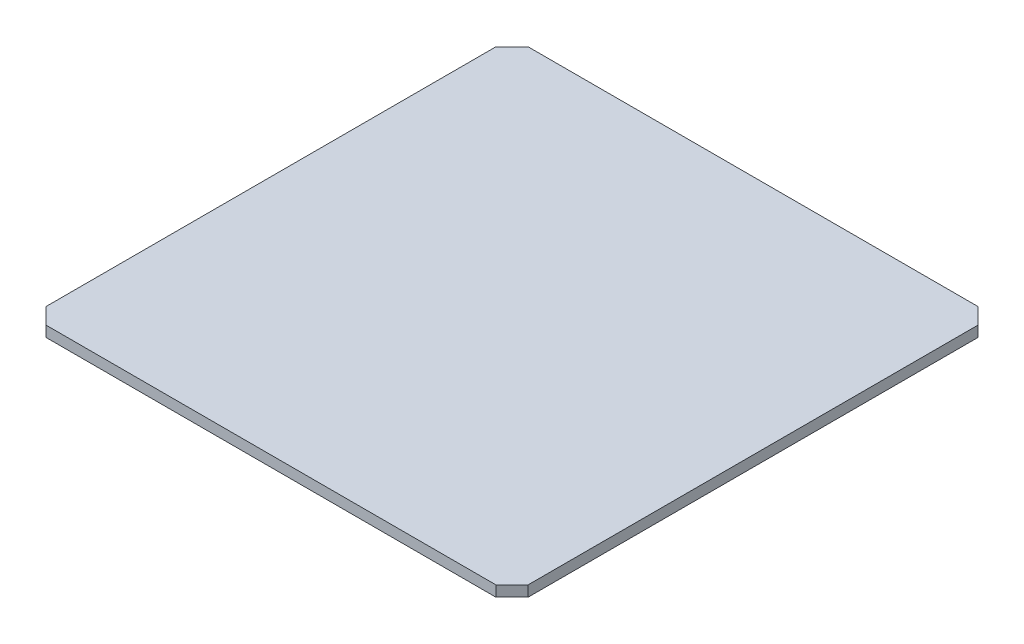
ISO-10303-21;
HEADER;
FILE_DESCRIPTION(('STEP AP214'),'2;1');
FILE_NAME('part.step','',(''),(''),'','','');
FILE_SCHEMA(('AUTOMOTIVE_DESIGN { 1 0 10303 214 1 1 1 1 }'));
ENDSEC;
DATA;
#1=APPLICATION_CONTEXT('core data for automotive mechanical design processes');
#2=APPLICATION_PROTOCOL_DEFINITION('international standard','automotive_design',2000,#1);
#3=PRODUCT_CONTEXT('',#1,'mechanical');
#4=PRODUCT('Part','Part','',(#3));
#5=PRODUCT_RELATED_PRODUCT_CATEGORY('part','',(#4));
#6=PRODUCT_DEFINITION_FORMATION('','',#4);
#7=PRODUCT_DEFINITION_CONTEXT('part definition',#1,'design');
#8=PRODUCT_DEFINITION('design','',#6,#7);
#9=PRODUCT_DEFINITION_SHAPE('','',#8);
#10=(LENGTH_UNIT() NAMED_UNIT(*) SI_UNIT(.MILLI.,.METRE.));
#11=(NAMED_UNIT(*) PLANE_ANGLE_UNIT() SI_UNIT($,.RADIAN.));
#12=(NAMED_UNIT(*) SI_UNIT($,.STERADIAN.) SOLID_ANGLE_UNIT());
#13=UNCERTAINTY_MEASURE_WITH_UNIT(LENGTH_MEASURE(1.E-05),#10,'distance_accuracy_value','');
#14=(GEOMETRIC_REPRESENTATION_CONTEXT(3) GLOBAL_UNCERTAINTY_ASSIGNED_CONTEXT((#13)) GLOBAL_UNIT_ASSIGNED_CONTEXT((#10,
#11,#12)) REPRESENTATION_CONTEXT('',''));
#15=CARTESIAN_POINT('',(0.,0.,0.));
#16=DIRECTION('',(0.,0.,1.));
#17=DIRECTION('',(1.,0.,0.));
#18=AXIS2_PLACEMENT_3D('',#15,#16,#17);
#19=CARTESIAN_POINT('',(0.,0.,0.));
#20=DIRECTION('',(0.,-1.,0.));
#21=DIRECTION('',(0.,0.,-1.));
#22=AXIS2_PLACEMENT_3D('',#19,#20,#21);
#23=PLANE('',#22);
#24=CARTESIAN_POINT('',(24.5,0.,-24.5));
#25=DIRECTION('',(0.,-1.,0.));
#26=DIRECTION('',(0.,0.,-1.));
#27=AXIS2_PLACEMENT_3D('',#24,#25,#26);
#28=CIRCLE('',#27,4.);
#29=CARTESIAN_POINT('',(24.5,0.,-28.5));
#30=VERTEX_POINT('',#29);
#31=EDGE_CURVE('E369',#30,#30,#28,.T.);
#32=ORIENTED_EDGE('',*,*,#31,.F.);
#33=EDGE_LOOP('',(#32));
#34=FACE_BOUND('',#33,.T.);
#35=CARTESIAN_POINT('',(-24.5,0.,-24.5));
#36=DIRECTION('',(0.,-1.,0.));
#37=DIRECTION('',(0.,0.,-1.));
#38=AXIS2_PLACEMENT_3D('',#35,#36,#37);
#39=CIRCLE('',#38,4.);
#40=CARTESIAN_POINT('',(-24.5,0.,-28.5));
#41=VERTEX_POINT('',#40);
#42=EDGE_CURVE('E357',#41,#41,#39,.T.);
#43=ORIENTED_EDGE('',*,*,#42,.F.);
#44=EDGE_LOOP('',(#43));
#45=FACE_BOUND('',#44,.T.);
#46=CARTESIAN_POINT('',(24.5,0.,24.5));
#47=DIRECTION('',(0.,-1.,0.));
#48=DIRECTION('',(0.,0.,-1.));
#49=AXIS2_PLACEMENT_3D('',#46,#47,#48);
#50=CIRCLE('',#49,4.);
#51=CARTESIAN_POINT('',(24.5,0.,20.5));
#52=VERTEX_POINT('',#51);
#53=EDGE_CURVE('E345',#52,#52,#50,.T.);
#54=ORIENTED_EDGE('',*,*,#53,.F.);
#55=EDGE_LOOP('',(#54));
#56=FACE_BOUND('',#55,.T.);
#57=CARTESIAN_POINT('',(-24.5,0.,24.5));
#58=DIRECTION('',(0.,-1.,0.));
#59=DIRECTION('',(0.,0.,-1.));
#60=AXIS2_PLACEMENT_3D('',#57,#58,#59);
#61=CIRCLE('',#60,4.);
#62=CARTESIAN_POINT('',(-24.5,0.,20.5));
#63=VERTEX_POINT('',#62);
#64=EDGE_CURVE('E331',#63,#63,#61,.T.);
#65=ORIENTED_EDGE('',*,*,#64,.F.);
#66=EDGE_LOOP('',(#65));
#67=FACE_BOUND('',#66,.T.);
#68=DIRECTION('',(-0.707106781186547,0.,0.707106781186547));
#69=VECTOR('',#68,1.);
#70=CARTESIAN_POINT('',(-45.,0.,-42.));
#71=LINE('',#70,#69);
#72=CARTESIAN_POINT('',(-42.,0.,-45.));
#73=VERTEX_POINT('',#72);
#74=CARTESIAN_POINT('',(-45.,0.,-42.));
#75=VERTEX_POINT('',#74);
#76=EDGE_CURVE('E160',#73,#75,#71,.T.);
#77=ORIENTED_EDGE('',*,*,#76,.F.);
#78=DIRECTION('',(-1.,0.,0.));
#79=VECTOR('',#78,1.);
#80=CARTESIAN_POINT('',(-42.,0.,-45.));
#81=LINE('',#80,#79);
#82=CARTESIAN_POINT('',(42.,0.,-45.));
#83=VERTEX_POINT('',#82);
#84=EDGE_CURVE('E103',#83,#73,#81,.T.);
#85=ORIENTED_EDGE('',*,*,#84,.F.);
#86=DIRECTION('',(-0.707106781186547,0.,-0.707106781186547));
#87=VECTOR('',#86,1.);
#88=CARTESIAN_POINT('',(42.,0.,-45.));
#89=LINE('',#88,#87);
#90=CARTESIAN_POINT('',(45.,0.,-42.));
#91=VERTEX_POINT('',#90);
#92=EDGE_CURVE('E179',#91,#83,#89,.T.);
#93=ORIENTED_EDGE('',*,*,#92,.F.);
#94=DIRECTION('',(0.,0.,-1.));
#95=VECTOR('',#94,1.);
#96=CARTESIAN_POINT('',(45.,0.,-42.));
#97=LINE('',#96,#95);
#98=CARTESIAN_POINT('',(45.,0.,42.));
#99=VERTEX_POINT('',#98);
#100=EDGE_CURVE('E145',#99,#91,#97,.T.);
#101=ORIENTED_EDGE('',*,*,#100,.F.);
#102=DIRECTION('',(0.707106781186548,0.,-0.707106781186547));
#103=VECTOR('',#102,1.);
#104=CARTESIAN_POINT('',(42.,0.,45.));
#105=LINE('',#104,#103);
#106=CARTESIAN_POINT('',(42.,0.,45.));
#107=VERTEX_POINT('',#106);
#108=EDGE_CURVE('E174',#107,#99,#105,.T.);
#109=ORIENTED_EDGE('',*,*,#108,.F.);
#110=DIRECTION('',(1.,0.,0.));
#111=VECTOR('',#110,1.);
#112=CARTESIAN_POINT('',(-42.,0.,45.));
#113=LINE('',#112,#111);
#114=CARTESIAN_POINT('',(-42.,0.,45.));
#115=VERTEX_POINT('',#114);
#116=EDGE_CURVE('E171',#115,#107,#113,.T.);
#117=ORIENTED_EDGE('',*,*,#116,.F.);
#118=DIRECTION('',(0.707106781186547,0.,0.707106781186548));
#119=VECTOR('',#118,1.);
#120=CARTESIAN_POINT('',(-45.,0.,42.));
#121=LINE('',#120,#119);
#122=CARTESIAN_POINT('',(-45.,0.,42.));
#123=VERTEX_POINT('',#122);
#124=EDGE_CURVE('E168',#123,#115,#121,.T.);
#125=ORIENTED_EDGE('',*,*,#124,.F.);
#126=DIRECTION('',(0.,0.,1.));
#127=VECTOR('',#126,1.);
#128=CARTESIAN_POINT('',(-45.,0.,-42.));
#129=LINE('',#128,#127);
#130=EDGE_CURVE('E164',#75,#123,#129,.T.);
#131=ORIENTED_EDGE('',*,*,#130,.F.);
#132=EDGE_LOOP('',(#77,#85,#93,#101,#109,#117,#125,#131));
#133=FACE_BOUND('',#132,.T.);
#134=DIRECTION('',(1.,0.,0.));
#135=VECTOR('',#134,1.);
#136=CARTESIAN_POINT('',(-7.5,0.,-3.75));
#137=LINE('',#136,#135);
#138=CARTESIAN_POINT('',(-7.5,0.,-3.75));
#139=VERTEX_POINT('',#138);
#140=CARTESIAN_POINT('',(7.5,0.,-3.75));
#141=VERTEX_POINT('',#140);
#142=EDGE_CURVE('E399',#139,#141,#137,.T.);
#143=ORIENTED_EDGE('',*,*,#142,.F.);
#144=DIRECTION('',(0.,0.,-1.));
#145=VECTOR('',#144,1.);
#146=CARTESIAN_POINT('',(-7.5,0.,3.75));
#147=LINE('',#146,#145);
#148=CARTESIAN_POINT('',(-7.5,0.,3.75));
#149=VERTEX_POINT('',#148);
#150=EDGE_CURVE('E403',#149,#139,#147,.T.);
#151=ORIENTED_EDGE('',*,*,#150,.F.);
#152=DIRECTION('',(-1.,0.,0.));
#153=VECTOR('',#152,1.);
#154=CARTESIAN_POINT('',(-7.5,0.,3.75));
#155=LINE('',#154,#153);
#156=CARTESIAN_POINT('',(7.5,0.,3.75));
#157=VERTEX_POINT('',#156);
#158=EDGE_CURVE('E392',#157,#149,#155,.T.);
#159=ORIENTED_EDGE('',*,*,#158,.F.);
#160=DIRECTION('',(0.,0.,1.));
#161=VECTOR('',#160,1.);
#162=CARTESIAN_POINT('',(7.5,0.,3.75));
#163=LINE('',#162,#161);
#164=EDGE_CURVE('E396',#141,#157,#163,.T.);
#165=ORIENTED_EDGE('',*,*,#164,.F.);
#166=EDGE_LOOP('',(#143,#151,#159,#165));
#167=FACE_BOUND('',#166,.T.);
#168=ADVANCED_FACE('F45',(#34,#45,#56,#67,#133,#167),#23,.T.);
#169=CARTESIAN_POINT('',(-45.,2.,-42.));
#170=DIRECTION('',(0.707106781186547,0.,0.707106781186547));
#171=DIRECTION('',(0.707106781186548,0.,-0.707106781186548));
#172=AXIS2_PLACEMENT_3D('',#169,#170,#171);
#173=PLANE('',#172);
#174=ORIENTED_EDGE('',*,*,#76,.T.);
#175=DIRECTION('',(0.,-1.,0.));
#176=VECTOR('',#175,1.);
#177=CARTESIAN_POINT('',(-45.,2.,-42.));
#178=LINE('',#177,#176);
#179=CARTESIAN_POINT('',(-45.,2.,-42.));
#180=VERTEX_POINT('',#179);
#181=EDGE_CURVE('E203',#180,#75,#178,.T.);
#182=ORIENTED_EDGE('',*,*,#181,.F.);
#183=DIRECTION('',(-0.707106781186547,0.,0.707106781186547));
#184=VECTOR('',#183,1.);
#185=CARTESIAN_POINT('',(-45.,2.,-42.));
#186=LINE('',#185,#184);
#187=CARTESIAN_POINT('',(-42.,2.,-45.));
#188=VERTEX_POINT('',#187);
#189=EDGE_CURVE('E184',#188,#180,#186,.T.);
#190=ORIENTED_EDGE('',*,*,#189,.F.);
#191=DIRECTION('',(0.,-1.,0.));
#192=VECTOR('',#191,1.);
#193=CARTESIAN_POINT('',(-42.,2.,-45.));
#194=LINE('',#193,#192);
#195=EDGE_CURVE('E156',#188,#73,#194,.T.);
#196=ORIENTED_EDGE('',*,*,#195,.T.);
#197=EDGE_LOOP('',(#174,#182,#190,#196));
#198=FACE_BOUND('',#197,.T.);
#199=ADVANCED_FACE('F47',(#198),#173,.F.);
#200=CARTESIAN_POINT('',(-45.,2.,-42.));
#201=DIRECTION('',(1.,0.,0.));
#202=DIRECTION('',(0.,0.,-1.));
#203=AXIS2_PLACEMENT_3D('',#200,#201,#202);
#204=PLANE('',#203);
#205=ORIENTED_EDGE('',*,*,#130,.T.);
#206=DIRECTION('',(0.,-1.,0.));
#207=VECTOR('',#206,1.);
#208=CARTESIAN_POINT('',(-45.,2.,42.));
#209=LINE('',#208,#207);
#210=CARTESIAN_POINT('',(-45.,2.,42.));
#211=VERTEX_POINT('',#210);
#212=EDGE_CURVE('E199',#211,#123,#209,.T.);
#213=ORIENTED_EDGE('',*,*,#212,.F.);
#214=DIRECTION('',(0.,0.,1.));
#215=VECTOR('',#214,1.);
#216=CARTESIAN_POINT('',(-45.,2.,-42.));
#217=LINE('',#216,#215);
#218=EDGE_CURVE('E112',#180,#211,#217,.T.);
#219=ORIENTED_EDGE('',*,*,#218,.F.);
#220=ORIENTED_EDGE('',*,*,#181,.T.);
#221=EDGE_LOOP('',(#205,#213,#219,#220));
#222=FACE_BOUND('',#221,.T.);
#223=ADVANCED_FACE('F251',(#222),#204,.F.);
#224=CARTESIAN_POINT('',(-45.,2.,42.));
#225=DIRECTION('',(0.707106781186548,0.,-0.707106781186547));
#226=DIRECTION('',(-0.707106781186547,0.,-0.707106781186548));
#227=AXIS2_PLACEMENT_3D('',#224,#225,#226);
#228=PLANE('',#227);
#229=ORIENTED_EDGE('',*,*,#124,.T.);
#230=DIRECTION('',(0.,-1.,0.));
#231=VECTOR('',#230,1.);
#232=CARTESIAN_POINT('',(-42.,2.,45.));
#233=LINE('',#232,#231);
#234=CARTESIAN_POINT('',(-42.,2.,45.));
#235=VERTEX_POINT('',#234);
#236=EDGE_CURVE('E195',#235,#115,#233,.T.);
#237=ORIENTED_EDGE('',*,*,#236,.F.);
#238=DIRECTION('',(0.707106781186547,0.,0.707106781186548));
#239=VECTOR('',#238,1.);
#240=CARTESIAN_POINT('',(-45.,2.,42.));
#241=LINE('',#240,#239);
#242=EDGE_CURVE('E314',#211,#235,#241,.T.);
#243=ORIENTED_EDGE('',*,*,#242,.F.);
#244=ORIENTED_EDGE('',*,*,#212,.T.);
#245=EDGE_LOOP('',(#229,#237,#243,#244));
#246=FACE_BOUND('',#245,.T.);
#247=ADVANCED_FACE('F301',(#246),#228,.F.);
#248=CARTESIAN_POINT('',(-42.,2.,45.));
#249=DIRECTION('',(0.,0.,-1.));
#250=DIRECTION('',(-1.,0.,0.));
#251=AXIS2_PLACEMENT_3D('',#248,#249,#250);
#252=PLANE('',#251);
#253=ORIENTED_EDGE('',*,*,#116,.T.);
#254=DIRECTION('',(0.,-1.,0.));
#255=VECTOR('',#254,1.);
#256=CARTESIAN_POINT('',(42.,2.,45.));
#257=LINE('',#256,#255);
#258=CARTESIAN_POINT('',(42.,2.,45.));
#259=VERTEX_POINT('',#258);
#260=EDGE_CURVE('E191',#259,#107,#257,.T.);
#261=ORIENTED_EDGE('',*,*,#260,.F.);
#262=DIRECTION('',(1.,0.,0.));
#263=VECTOR('',#262,1.);
#264=CARTESIAN_POINT('',(-42.,2.,45.));
#265=LINE('',#264,#263);
#266=EDGE_CURVE('E321',#235,#259,#265,.T.);
#267=ORIENTED_EDGE('',*,*,#266,.F.);
#268=ORIENTED_EDGE('',*,*,#236,.T.);
#269=EDGE_LOOP('',(#253,#261,#267,#268));
#270=FACE_BOUND('',#269,.T.);
#271=ADVANCED_FACE('F297',(#270),#252,.F.);
#272=CARTESIAN_POINT('',(42.,2.,45.));
#273=DIRECTION('',(-0.707106781186547,0.,-0.707106781186548));
#274=DIRECTION('',(-0.707106781186548,0.,0.707106781186547));
#275=AXIS2_PLACEMENT_3D('',#272,#273,#274);
#276=PLANE('',#275);
#277=ORIENTED_EDGE('',*,*,#108,.T.);
#278=DIRECTION('',(0.,-1.,0.));
#279=VECTOR('',#278,1.);
#280=CARTESIAN_POINT('',(45.,2.,42.));
#281=LINE('',#280,#279);
#282=CARTESIAN_POINT('',(45.,2.,42.));
#283=VERTEX_POINT('',#282);
#284=EDGE_CURVE('E149',#283,#99,#281,.T.);
#285=ORIENTED_EDGE('',*,*,#284,.F.);
#286=DIRECTION('',(0.707106781186548,0.,-0.707106781186547));
#287=VECTOR('',#286,1.);
#288=CARTESIAN_POINT('',(42.,2.,45.));
#289=LINE('',#288,#287);
#290=EDGE_CURVE('E135',#259,#283,#289,.T.);
#291=ORIENTED_EDGE('',*,*,#290,.F.);
#292=ORIENTED_EDGE('',*,*,#260,.T.);
#293=EDGE_LOOP('',(#277,#285,#291,#292));
#294=FACE_BOUND('',#293,.T.);
#295=ADVANCED_FACE('F294',(#294),#276,.F.);
#296=CARTESIAN_POINT('',(45.,2.,-42.));
#297=DIRECTION('',(-1.,0.,0.));
#298=DIRECTION('',(0.,0.,1.));
#299=AXIS2_PLACEMENT_3D('',#296,#297,#298);
#300=PLANE('',#299);
#301=ORIENTED_EDGE('',*,*,#100,.T.);
#302=DIRECTION('',(0.,-1.,0.));
#303=VECTOR('',#302,1.);
#304=CARTESIAN_POINT('',(45.,2.,-42.));
#305=LINE('',#304,#303);
#306=CARTESIAN_POINT('',(45.,2.,-42.));
#307=VERTEX_POINT('',#306);
#308=EDGE_CURVE('E142',#307,#91,#305,.T.);
#309=ORIENTED_EDGE('',*,*,#308,.F.);
#310=DIRECTION('',(0.,0.,-1.));
#311=VECTOR('',#310,1.);
#312=CARTESIAN_POINT('',(45.,2.,-42.));
#313=LINE('',#312,#311);
#314=EDGE_CURVE('E128',#283,#307,#313,.T.);
#315=ORIENTED_EDGE('',*,*,#314,.F.);
#316=ORIENTED_EDGE('',*,*,#284,.T.);
#317=EDGE_LOOP('',(#301,#309,#315,#316));
#318=FACE_BOUND('',#317,.T.);
#319=ADVANCED_FACE('F143',(#318),#300,.F.);
#320=CARTESIAN_POINT('',(42.,2.,-45.));
#321=DIRECTION('',(-0.707106781186547,0.,0.707106781186547));
#322=DIRECTION('',(0.707106781186548,0.,0.707106781186548));
#323=AXIS2_PLACEMENT_3D('',#320,#321,#322);
#324=PLANE('',#323);
#325=ORIENTED_EDGE('',*,*,#92,.T.);
#326=DIRECTION('',(0.,-1.,0.));
#327=VECTOR('',#326,1.);
#328=CARTESIAN_POINT('',(42.,2.,-45.));
#329=LINE('',#328,#327);
#330=CARTESIAN_POINT('',(42.,2.,-45.));
#331=VERTEX_POINT('',#330);
#332=EDGE_CURVE('E150',#331,#83,#329,.T.);
#333=ORIENTED_EDGE('',*,*,#332,.F.);
#334=DIRECTION('',(-0.707106781186547,0.,-0.707106781186547));
#335=VECTOR('',#334,1.);
#336=CARTESIAN_POINT('',(42.,2.,-45.));
#337=LINE('',#336,#335);
#338=EDGE_CURVE('E132',#307,#331,#337,.T.);
#339=ORIENTED_EDGE('',*,*,#338,.F.);
#340=ORIENTED_EDGE('',*,*,#308,.T.);
#341=EDGE_LOOP('',(#325,#333,#339,#340));
#342=FACE_BOUND('',#341,.T.);
#343=ADVANCED_FACE('F152',(#342),#324,.F.);
#344=CARTESIAN_POINT('',(-42.,2.,-45.));
#345=DIRECTION('',(0.,0.,1.));
#346=DIRECTION('',(1.,0.,0.));
#347=AXIS2_PLACEMENT_3D('',#344,#345,#346);
#348=PLANE('',#347);
#349=ORIENTED_EDGE('',*,*,#84,.T.);
#350=ORIENTED_EDGE('',*,*,#195,.F.);
#351=DIRECTION('',(-1.,0.,0.));
#352=VECTOR('',#351,1.);
#353=CARTESIAN_POINT('',(-42.,2.,-45.));
#354=LINE('',#353,#352);
#355=EDGE_CURVE('E70',#331,#188,#354,.T.);
#356=ORIENTED_EDGE('',*,*,#355,.F.);
#357=ORIENTED_EDGE('',*,*,#332,.T.);
#358=EDGE_LOOP('',(#349,#350,#356,#357));
#359=FACE_BOUND('',#358,.T.);
#360=ADVANCED_FACE('F283',(#359),#348,.F.);
#361=CARTESIAN_POINT('',(0.,2.,0.));
#362=DIRECTION('',(0.,-1.,0.));
#363=DIRECTION('',(0.,0.,-1.));
#364=AXIS2_PLACEMENT_3D('',#361,#362,#363);
#365=PLANE('',#364);
#366=ORIENTED_EDGE('',*,*,#189,.T.);
#367=ORIENTED_EDGE('',*,*,#218,.T.);
#368=ORIENTED_EDGE('',*,*,#242,.T.);
#369=ORIENTED_EDGE('',*,*,#266,.T.);
#370=ORIENTED_EDGE('',*,*,#290,.T.);
#371=ORIENTED_EDGE('',*,*,#314,.T.);
#372=ORIENTED_EDGE('',*,*,#338,.T.);
#373=ORIENTED_EDGE('',*,*,#355,.T.);
#374=EDGE_LOOP('',(#366,#367,#368,#369,#370,#371,#372,#373));
#375=FACE_BOUND('',#374,.T.);
#376=ADVANCED_FACE('F130',(#375),#365,.F.);
#377=CARTESIAN_POINT('',(-24.5,-6.25,24.5));
#378=DIRECTION('',(0.,-1.,0.));
#379=DIRECTION('',(0.,0.,-1.));
#380=AXIS2_PLACEMENT_3D('',#377,#378,#379);
#381=PLANE('',#380);
#382=CARTESIAN_POINT('',(-24.5,-6.25,24.5));
#383=DIRECTION('',(0.,-1.,0.));
#384=DIRECTION('',(0.,0.,-1.));
#385=AXIS2_PLACEMENT_3D('',#382,#383,#384);
#386=CIRCLE('',#385,4.);
#387=CARTESIAN_POINT('',(-24.5,-6.25,20.5));
#388=VERTEX_POINT('',#387);
#389=EDGE_CURVE('E165',#388,#388,#386,.T.);
#390=ORIENTED_EDGE('',*,*,#389,.T.);
#391=EDGE_LOOP('',(#390));
#392=FACE_BOUND('',#391,.T.);
#393=CARTESIAN_POINT('',(-24.5,-6.25,24.5));
#394=DIRECTION('',(0.,-1.,0.));
#395=DIRECTION('',(0.,0.,-1.));
#396=AXIS2_PLACEMENT_3D('',#393,#394,#395);
#397=CIRCLE('',#396,1.5);
#398=CARTESIAN_POINT('',(-24.5,-6.25,23.));
#399=VERTEX_POINT('',#398);
#400=EDGE_CURVE('E335',#399,#399,#397,.T.);
#401=ORIENTED_EDGE('',*,*,#400,.F.);
#402=EDGE_LOOP('',(#401));
#403=FACE_BOUND('',#402,.T.);
#404=ADVANCED_FACE('F274',(#392,#403),#381,.T.);
#405=CARTESIAN_POINT('',(-24.5,-6.25,24.5));
#406=DIRECTION('',(0.,1.,0.));
#407=DIRECTION('',(0.,0.,1.));
#408=AXIS2_PLACEMENT_3D('',#405,#406,#407);
#409=CYLINDRICAL_SURFACE('',#408,4.);
#410=ORIENTED_EDGE('',*,*,#389,.F.);
#411=EDGE_LOOP('',(#410));
#412=FACE_BOUND('',#411,.T.);
#413=ORIENTED_EDGE('',*,*,#64,.T.);
#414=EDGE_LOOP('',(#413));
#415=FACE_BOUND('',#414,.T.);
#416=ADVANCED_FACE('F266',(#412,#415),#409,.T.);
#417=CARTESIAN_POINT('',(-24.5,-6.25,24.5));
#418=DIRECTION('',(0.,1.,0.));
#419=DIRECTION('',(0.,0.,1.));
#420=AXIS2_PLACEMENT_3D('',#417,#418,#419);
#421=CYLINDRICAL_SURFACE('',#420,1.5);
#422=ORIENTED_EDGE('',*,*,#400,.T.);
#423=EDGE_LOOP('',(#422));
#424=FACE_BOUND('',#423,.T.);
#425=CARTESIAN_POINT('',(-24.5,0.,24.5));
#426=DIRECTION('',(0.,-1.,0.));
#427=DIRECTION('',(0.,0.,-1.));
#428=AXIS2_PLACEMENT_3D('',#425,#426,#427);
#429=CIRCLE('',#428,1.5);
#430=CARTESIAN_POINT('',(-24.5,0.,23.));
#431=VERTEX_POINT('',#430);
#432=EDGE_CURVE('E206',#431,#431,#429,.F.);
#433=ORIENTED_EDGE('',*,*,#432,.T.);
#434=EDGE_LOOP('',(#433));
#435=FACE_BOUND('',#434,.T.);
#436=ADVANCED_FACE('F257',(#424,#435),#421,.F.);
#437=ORIENTED_EDGE('',*,*,#432,.F.);
#438=EDGE_LOOP('',(#437));
#439=FACE_BOUND('',#438,.T.);
#440=ADVANCED_FACE('F241',(#439),#23,.T.);
#441=CARTESIAN_POINT('',(24.5,-6.25,24.5));
#442=DIRECTION('',(0.,-1.,0.));
#443=DIRECTION('',(0.,0.,-1.));
#444=AXIS2_PLACEMENT_3D('',#441,#442,#443);
#445=PLANE('',#444);
#446=CARTESIAN_POINT('',(24.5,-6.25,24.5));
#447=DIRECTION('',(0.,-1.,0.));
#448=DIRECTION('',(0.,0.,-1.));
#449=AXIS2_PLACEMENT_3D('',#446,#447,#448);
#450=CIRCLE('',#449,4.);
#451=CARTESIAN_POINT('',(24.5,-6.25,20.5));
#452=VERTEX_POINT('',#451);
#453=EDGE_CURVE('E346',#452,#452,#450,.T.);
#454=ORIENTED_EDGE('',*,*,#453,.T.);
#455=EDGE_LOOP('',(#454));
#456=FACE_BOUND('',#455,.T.);
#457=CARTESIAN_POINT('',(24.5,-6.25,24.5));
#458=DIRECTION('',(0.,-1.,0.));
#459=DIRECTION('',(0.,0.,-1.));
#460=AXIS2_PLACEMENT_3D('',#457,#458,#459);
#461=CIRCLE('',#460,1.5);
#462=CARTESIAN_POINT('',(24.5,-6.25,23.));
#463=VERTEX_POINT('',#462);
#464=EDGE_CURVE('E341',#463,#463,#461,.T.);
#465=ORIENTED_EDGE('',*,*,#464,.F.);
#466=EDGE_LOOP('',(#465));
#467=FACE_BOUND('',#466,.T.);
#468=ADVANCED_FACE('F256',(#456,#467),#445,.T.);
#469=CARTESIAN_POINT('',(24.5,-6.25,24.5));
#470=DIRECTION('',(0.,1.,0.));
#471=DIRECTION('',(0.,0.,1.));
#472=AXIS2_PLACEMENT_3D('',#469,#470,#471);
#473=CYLINDRICAL_SURFACE('',#472,4.);
#474=ORIENTED_EDGE('',*,*,#453,.F.);
#475=EDGE_LOOP('',(#474));
#476=FACE_BOUND('',#475,.T.);
#477=ORIENTED_EDGE('',*,*,#53,.T.);
#478=EDGE_LOOP('',(#477));
#479=FACE_BOUND('',#478,.T.);
#480=ADVANCED_FACE('F263',(#476,#479),#473,.T.);
#481=CARTESIAN_POINT('',(24.5,-6.25,24.5));
#482=DIRECTION('',(0.,1.,0.));
#483=DIRECTION('',(0.,0.,1.));
#484=AXIS2_PLACEMENT_3D('',#481,#482,#483);
#485=CYLINDRICAL_SURFACE('',#484,1.5);
#486=ORIENTED_EDGE('',*,*,#464,.T.);
#487=EDGE_LOOP('',(#486));
#488=FACE_BOUND('',#487,.T.);
#489=CARTESIAN_POINT('',(24.5,0.,24.5));
#490=DIRECTION('',(0.,-1.,0.));
#491=DIRECTION('',(0.,0.,-1.));
#492=AXIS2_PLACEMENT_3D('',#489,#490,#491);
#493=CIRCLE('',#492,1.5);
#494=CARTESIAN_POINT('',(24.5,0.,23.));
#495=VERTEX_POINT('',#494);
#496=EDGE_CURVE('E210',#495,#495,#493,.F.);
#497=ORIENTED_EDGE('',*,*,#496,.T.);
#498=EDGE_LOOP('',(#497));
#499=FACE_BOUND('',#498,.T.);
#500=ADVANCED_FACE('F239',(#488,#499),#485,.F.);
#501=ORIENTED_EDGE('',*,*,#496,.F.);
#502=EDGE_LOOP('',(#501));
#503=FACE_BOUND('',#502,.T.);
#504=ADVANCED_FACE('F223',(#503),#23,.T.);
#505=CARTESIAN_POINT('',(-24.5,-6.25,-24.5));
#506=DIRECTION('',(0.,-1.,0.));
#507=DIRECTION('',(0.,0.,-1.));
#508=AXIS2_PLACEMENT_3D('',#505,#506,#507);
#509=PLANE('',#508);
#510=CARTESIAN_POINT('',(-24.5,-6.25,-24.5));
#511=DIRECTION('',(0.,-1.,0.));
#512=DIRECTION('',(0.,0.,-1.));
#513=AXIS2_PLACEMENT_3D('',#510,#511,#512);
#514=CIRCLE('',#513,4.);
#515=CARTESIAN_POINT('',(-24.5,-6.25,-28.5));
#516=VERTEX_POINT('',#515);
#517=EDGE_CURVE('E358',#516,#516,#514,.T.);
#518=ORIENTED_EDGE('',*,*,#517,.T.);
#519=EDGE_LOOP('',(#518));
#520=FACE_BOUND('',#519,.T.);
#521=CARTESIAN_POINT('',(-24.5,-6.25,-24.5));
#522=DIRECTION('',(0.,-1.,0.));
#523=DIRECTION('',(0.,0.,-1.));
#524=AXIS2_PLACEMENT_3D('',#521,#522,#523);
#525=CIRCLE('',#524,1.5);
#526=CARTESIAN_POINT('',(-24.5,-6.25,-26.));
#527=VERTEX_POINT('',#526);
#528=EDGE_CURVE('E350',#527,#527,#525,.T.);
#529=ORIENTED_EDGE('',*,*,#528,.F.);
#530=EDGE_LOOP('',(#529));
#531=FACE_BOUND('',#530,.T.);
#532=ADVANCED_FACE('F238',(#520,#531),#509,.T.);
#533=CARTESIAN_POINT('',(-24.5,-6.25,-24.5));
#534=DIRECTION('',(0.,1.,0.));
#535=DIRECTION('',(0.,0.,1.));
#536=AXIS2_PLACEMENT_3D('',#533,#534,#535);
#537=CYLINDRICAL_SURFACE('',#536,4.);
#538=ORIENTED_EDGE('',*,*,#517,.F.);
#539=EDGE_LOOP('',(#538));
#540=FACE_BOUND('',#539,.T.);
#541=ORIENTED_EDGE('',*,*,#42,.T.);
#542=EDGE_LOOP('',(#541));
#543=FACE_BOUND('',#542,.T.);
#544=ADVANCED_FACE('F232',(#540,#543),#537,.T.);
#545=CARTESIAN_POINT('',(-24.5,-6.25,-24.5));
#546=DIRECTION('',(0.,1.,0.));
#547=DIRECTION('',(0.,0.,1.));
#548=AXIS2_PLACEMENT_3D('',#545,#546,#547);
#549=CYLINDRICAL_SURFACE('',#548,1.5);
#550=ORIENTED_EDGE('',*,*,#528,.T.);
#551=EDGE_LOOP('',(#550));
#552=FACE_BOUND('',#551,.T.);
#553=CARTESIAN_POINT('',(-24.5,0.,-24.5));
#554=DIRECTION('',(0.,-1.,0.));
#555=DIRECTION('',(0.,0.,-1.));
#556=AXIS2_PLACEMENT_3D('',#553,#554,#555);
#557=CIRCLE('',#556,1.5);
#558=CARTESIAN_POINT('',(-24.5,0.,-26.));
#559=VERTEX_POINT('',#558);
#560=EDGE_CURVE('E54',#559,#559,#557,.F.);
#561=ORIENTED_EDGE('',*,*,#560,.T.);
#562=EDGE_LOOP('',(#561));
#563=FACE_BOUND('',#562,.T.);
#564=ADVANCED_FACE('F217',(#552,#563),#549,.F.);
#565=ORIENTED_EDGE('',*,*,#560,.F.);
#566=EDGE_LOOP('',(#565));
#567=FACE_BOUND('',#566,.T.);
#568=ADVANCED_FACE('F219',(#567),#23,.T.);
#569=CARTESIAN_POINT('',(24.5,-6.25,-24.5));
#570=DIRECTION('',(0.,-1.,0.));
#571=DIRECTION('',(0.,0.,-1.));
#572=AXIS2_PLACEMENT_3D('',#569,#570,#571);
#573=PLANE('',#572);
#574=CARTESIAN_POINT('',(24.5,-6.25,-24.5));
#575=DIRECTION('',(0.,-1.,0.));
#576=DIRECTION('',(0.,0.,-1.));
#577=AXIS2_PLACEMENT_3D('',#574,#575,#576);
#578=CIRCLE('',#577,4.);
#579=CARTESIAN_POINT('',(24.5,-6.25,-28.5));
#580=VERTEX_POINT('',#579);
#581=EDGE_CURVE('E370',#580,#580,#578,.T.);
#582=ORIENTED_EDGE('',*,*,#581,.T.);
#583=EDGE_LOOP('',(#582));
#584=FACE_BOUND('',#583,.T.);
#585=CARTESIAN_POINT('',(24.5,-6.25,-24.5));
#586=DIRECTION('',(0.,-1.,0.));
#587=DIRECTION('',(0.,0.,-1.));
#588=AXIS2_PLACEMENT_3D('',#585,#586,#587);
#589=CIRCLE('',#588,1.5);
#590=CARTESIAN_POINT('',(24.5,-6.25,-26.));
#591=VERTEX_POINT('',#590);
#592=EDGE_CURVE('E362',#591,#591,#589,.T.);
#593=ORIENTED_EDGE('',*,*,#592,.F.);
#594=EDGE_LOOP('',(#593));
#595=FACE_BOUND('',#594,.T.);
#596=ADVANCED_FACE('F221',(#584,#595),#573,.T.);
#597=CARTESIAN_POINT('',(24.5,-6.25,-24.5));
#598=DIRECTION('',(0.,1.,0.));
#599=DIRECTION('',(0.,0.,1.));
#600=AXIS2_PLACEMENT_3D('',#597,#598,#599);
#601=CYLINDRICAL_SURFACE('',#600,4.);
#602=ORIENTED_EDGE('',*,*,#581,.F.);
#603=EDGE_LOOP('',(#602));
#604=FACE_BOUND('',#603,.T.);
#605=ORIENTED_EDGE('',*,*,#31,.T.);
#606=EDGE_LOOP('',(#605));
#607=FACE_BOUND('',#606,.T.);
#608=ADVANCED_FACE('F229',(#604,#607),#601,.T.);
#609=CARTESIAN_POINT('',(24.5,-6.25,-24.5));
#610=DIRECTION('',(0.,1.,0.));
#611=DIRECTION('',(0.,0.,1.));
#612=AXIS2_PLACEMENT_3D('',#609,#610,#611);
#613=CYLINDRICAL_SURFACE('',#612,1.5);
#614=ORIENTED_EDGE('',*,*,#592,.T.);
#615=EDGE_LOOP('',(#614));
#616=FACE_BOUND('',#615,.T.);
#617=CARTESIAN_POINT('',(24.5,0.,-24.5));
#618=DIRECTION('',(0.,-1.,0.));
#619=DIRECTION('',(0.,0.,-1.));
#620=AXIS2_PLACEMENT_3D('',#617,#618,#619);
#621=CIRCLE('',#620,1.5);
#622=CARTESIAN_POINT('',(24.5,0.,-26.));
#623=VERTEX_POINT('',#622);
#624=EDGE_CURVE('E11',#623,#623,#621,.F.);
#625=ORIENTED_EDGE('',*,*,#624,.T.);
#626=EDGE_LOOP('',(#625));
#627=FACE_BOUND('',#626,.T.);
#628=ADVANCED_FACE('F244',(#616,#627),#613,.F.);
#629=ORIENTED_EDGE('',*,*,#624,.F.);
#630=EDGE_LOOP('',(#629));
#631=FACE_BOUND('',#630,.T.);
#632=ADVANCED_FACE('F224',(#631),#23,.T.);
#633=CARTESIAN_POINT('',(-7.5,-10.,3.75));
#634=DIRECTION('',(1.,0.,0.));
#635=DIRECTION('',(0.,0.,-1.));
#636=AXIS2_PLACEMENT_3D('',#633,#634,#635);
#637=PLANE('',#636);
#638=ORIENTED_EDGE('',*,*,#150,.T.);
#639=DIRECTION('',(0.,1.,0.));
#640=VECTOR('',#639,1.);
#641=CARTESIAN_POINT('',(-7.5,-10.,-3.75));
#642=LINE('',#641,#640);
#643=CARTESIAN_POINT('',(-7.5,-10.,-3.75));
#644=VERTEX_POINT('',#643);
#645=EDGE_CURVE('E374',#644,#139,#642,.T.);
#646=ORIENTED_EDGE('',*,*,#645,.F.);
#647=DIRECTION('',(0.,0.,-1.));
#648=VECTOR('',#647,1.);
#649=CARTESIAN_POINT('',(-7.5,-10.,3.75));
#650=LINE('',#649,#648);
#651=CARTESIAN_POINT('',(-7.5,-10.,3.75));
#652=VERTEX_POINT('',#651);
#653=EDGE_CURVE('E395',#652,#644,#650,.T.);
#654=ORIENTED_EDGE('',*,*,#653,.F.);
#655=DIRECTION('',(0.,1.,0.));
#656=VECTOR('',#655,1.);
#657=CARTESIAN_POINT('',(-7.5,-10.,3.75));
#658=LINE('',#657,#656);
#659=EDGE_CURVE('E387',#652,#149,#658,.T.);
#660=ORIENTED_EDGE('',*,*,#659,.T.);
#661=EDGE_LOOP('',(#638,#646,#654,#660));
#662=FACE_BOUND('',#661,.T.);
#663=ADVANCED_FACE('F243',(#662),#637,.F.);
#664=CARTESIAN_POINT('',(-7.5,-10.,-3.75));
#665=DIRECTION('',(0.,0.,1.));
#666=DIRECTION('',(1.,0.,0.));
#667=AXIS2_PLACEMENT_3D('',#664,#665,#666);
#668=PLANE('',#667);
#669=ORIENTED_EDGE('',*,*,#142,.T.);
#670=DIRECTION('',(0.,1.,0.));
#671=VECTOR('',#670,1.);
#672=CARTESIAN_POINT('',(7.5,-10.,-3.75));
#673=LINE('',#672,#671);
#674=CARTESIAN_POINT('',(7.5,-10.,-3.75));
#675=VERTEX_POINT('',#674);
#676=EDGE_CURVE('E381',#675,#141,#673,.T.);
#677=ORIENTED_EDGE('',*,*,#676,.F.);
#678=DIRECTION('',(1.,0.,0.));
#679=VECTOR('',#678,1.);
#680=CARTESIAN_POINT('',(-7.5,-10.,-3.75));
#681=LINE('',#680,#679);
#682=EDGE_CURVE('E414',#644,#675,#681,.T.);
#683=ORIENTED_EDGE('',*,*,#682,.F.);
#684=ORIENTED_EDGE('',*,*,#645,.T.);
#685=EDGE_LOOP('',(#669,#677,#683,#684));
#686=FACE_BOUND('',#685,.T.);
#687=ADVANCED_FACE('F435',(#686),#668,.F.);
#688=CARTESIAN_POINT('',(7.5,-10.,3.75));
#689=DIRECTION('',(-1.,0.,0.));
#690=DIRECTION('',(0.,0.,1.));
#691=AXIS2_PLACEMENT_3D('',#688,#689,#690);
#692=PLANE('',#691);
#693=ORIENTED_EDGE('',*,*,#164,.T.);
#694=DIRECTION('',(0.,1.,0.));
#695=VECTOR('',#694,1.);
#696=CARTESIAN_POINT('',(7.5,-10.,3.75));
#697=LINE('',#696,#695);
#698=CARTESIAN_POINT('',(7.5,-10.,3.75));
#699=VERTEX_POINT('',#698);
#700=EDGE_CURVE('E61',#699,#157,#697,.T.);
#701=ORIENTED_EDGE('',*,*,#700,.F.);
#702=DIRECTION('',(0.,0.,1.));
#703=VECTOR('',#702,1.);
#704=CARTESIAN_POINT('',(7.5,-10.,3.75));
#705=LINE('',#704,#703);
#706=EDGE_CURVE('E410',#675,#699,#705,.T.);
#707=ORIENTED_EDGE('',*,*,#706,.F.);
#708=ORIENTED_EDGE('',*,*,#676,.T.);
#709=EDGE_LOOP('',(#693,#701,#707,#708));
#710=FACE_BOUND('',#709,.T.);
#711=ADVANCED_FACE('F444',(#710),#692,.F.);
#712=CARTESIAN_POINT('',(-7.5,-10.,3.75));
#713=DIRECTION('',(0.,0.,-1.));
#714=DIRECTION('',(-1.,0.,0.));
#715=AXIS2_PLACEMENT_3D('',#712,#713,#714);
#716=PLANE('',#715);
#717=ORIENTED_EDGE('',*,*,#158,.T.);
#718=ORIENTED_EDGE('',*,*,#659,.F.);
#719=DIRECTION('',(-1.,0.,0.));
#720=VECTOR('',#719,1.);
#721=CARTESIAN_POINT('',(-7.5,-10.,3.75));
#722=LINE('',#721,#720);
#723=EDGE_CURVE('E391',#699,#652,#722,.T.);
#724=ORIENTED_EDGE('',*,*,#723,.F.);
#725=ORIENTED_EDGE('',*,*,#700,.T.);
#726=EDGE_LOOP('',(#717,#718,#724,#725));
#727=FACE_BOUND('',#726,.T.);
#728=ADVANCED_FACE('F447',(#727),#716,.F.);
#729=CARTESIAN_POINT('',(0.,-10.,0.));
#730=DIRECTION('',(0.,-1.,0.));
#731=DIRECTION('',(0.,0.,-1.));
#732=AXIS2_PLACEMENT_3D('',#729,#730,#731);
#733=PLANE('',#732);
#734=ORIENTED_EDGE('',*,*,#653,.T.);
#735=ORIENTED_EDGE('',*,*,#682,.T.);
#736=ORIENTED_EDGE('',*,*,#706,.T.);
#737=ORIENTED_EDGE('',*,*,#723,.T.);
#738=EDGE_LOOP('',(#734,#735,#736,#737));
#739=FACE_BOUND('',#738,.T.);
#740=ADVANCED_FACE('F424',(#739),#733,.T.);
#741=CLOSED_SHELL('',(#168,#199,#223,#247,#271,#295,#319,#343,#360,#376,#404,#416,#436,#440,
#468,#480,#500,#504,#532,#544,#564,#568,#596,#608,#628,#632,#663,#687,#711,#728,#740));
#742=MANIFOLD_SOLID_BREP('B2',#741);
#743=ADVANCED_BREP_SHAPE_REPRESENTATION('',(#18,#742),#14);
#744=SHAPE_DEFINITION_REPRESENTATION(#9,#743);
ENDSEC;
END-ISO-10303-21;
